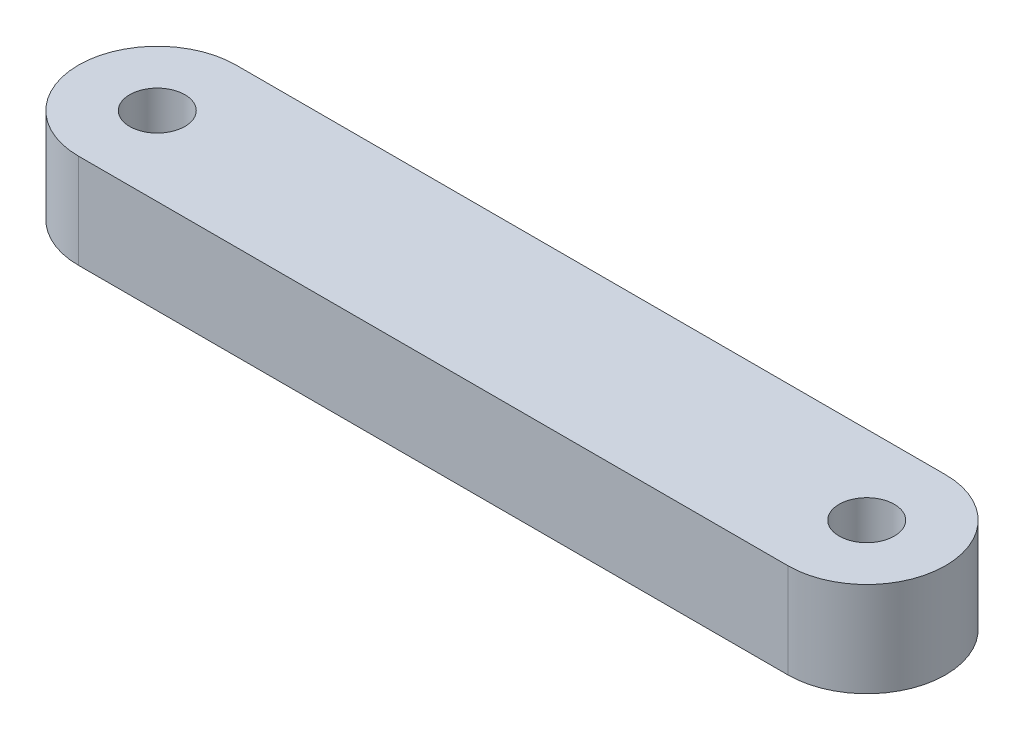
ISO-10303-21;
HEADER;
FILE_DESCRIPTION(('STEP AP214'),'2;1');
FILE_NAME('part.step','',(''),(''),'','','');
FILE_SCHEMA(('AUTOMOTIVE_DESIGN { 1 0 10303 214 1 1 1 1 }'));
ENDSEC;
DATA;
#1=APPLICATION_CONTEXT('core data for automotive mechanical design processes');
#2=APPLICATION_PROTOCOL_DEFINITION('international standard','automotive_design',2000,#1);
#3=PRODUCT_CONTEXT('',#1,'mechanical');
#4=PRODUCT('Part','Part','',(#3));
#5=PRODUCT_RELATED_PRODUCT_CATEGORY('part','',(#4));
#6=PRODUCT_DEFINITION_FORMATION('','',#4);
#7=PRODUCT_DEFINITION_CONTEXT('part definition',#1,'design');
#8=PRODUCT_DEFINITION('design','',#6,#7);
#9=PRODUCT_DEFINITION_SHAPE('','',#8);
#10=(LENGTH_UNIT() NAMED_UNIT(*) SI_UNIT(.MILLI.,.METRE.));
#11=(NAMED_UNIT(*) PLANE_ANGLE_UNIT() SI_UNIT($,.RADIAN.));
#12=(NAMED_UNIT(*) SI_UNIT($,.STERADIAN.) SOLID_ANGLE_UNIT());
#13=UNCERTAINTY_MEASURE_WITH_UNIT(LENGTH_MEASURE(1.E-05),#10,'distance_accuracy_value','');
#14=(GEOMETRIC_REPRESENTATION_CONTEXT(3) GLOBAL_UNCERTAINTY_ASSIGNED_CONTEXT((#13)) GLOBAL_UNIT_ASSIGNED_CONTEXT((#10,
#11,#12)) REPRESENTATION_CONTEXT('',''));
#15=CARTESIAN_POINT('',(0.,0.,0.));
#16=DIRECTION('',(0.,0.,1.));
#17=DIRECTION('',(1.,0.,0.));
#18=AXIS2_PLACEMENT_3D('',#15,#16,#17);
#19=CARTESIAN_POINT('',(-22.5,6.,0.));
#20=DIRECTION('',(0.,1.,0.));
#21=DIRECTION('',(0.,0.,1.));
#22=AXIS2_PLACEMENT_3D('',#19,#20,#21);
#23=PLANE('',#22);
#24=CARTESIAN_POINT('',(-22.5,6.,0.));
#25=DIRECTION('',(0.,1.,0.));
#26=DIRECTION('',(0.,0.,1.));
#27=AXIS2_PLACEMENT_3D('',#24,#25,#26);
#28=CIRCLE('',#27,1.75);
#29=CARTESIAN_POINT('',(-22.5,6.,1.75));
#30=VERTEX_POINT('',#29);
#31=EDGE_CURVE('E103',#30,#30,#28,.T.);
#32=ORIENTED_EDGE('',*,*,#31,.F.);
#33=EDGE_LOOP('',(#32));
#34=FACE_BOUND('',#33,.T.);
#35=CARTESIAN_POINT('',(-22.5,6.,0.));
#36=DIRECTION('',(0.,1.,0.));
#37=DIRECTION('',(0.,0.,1.));
#38=AXIS2_PLACEMENT_3D('',#35,#36,#37);
#39=CIRCLE('',#38,5.);
#40=CARTESIAN_POINT('',(-22.5,6.,-5.));
#41=VERTEX_POINT('',#40);
#42=CARTESIAN_POINT('',(-22.5,6.,5.));
#43=VERTEX_POINT('',#42);
#44=EDGE_CURVE('E88',#41,#43,#39,.T.);
#45=ORIENTED_EDGE('',*,*,#44,.T.);
#46=DIRECTION('',(1.,0.,0.));
#47=VECTOR('',#46,1.);
#48=CARTESIAN_POINT('',(-22.5,6.,5.));
#49=LINE('',#48,#47);
#50=CARTESIAN_POINT('',(22.5,6.,5.));
#51=VERTEX_POINT('',#50);
#52=EDGE_CURVE('E83',#43,#51,#49,.T.);
#53=ORIENTED_EDGE('',*,*,#52,.T.);
#54=CARTESIAN_POINT('',(22.5,6.,0.));
#55=DIRECTION('',(0.,1.,0.));
#56=DIRECTION('',(0.,0.,1.));
#57=AXIS2_PLACEMENT_3D('',#54,#55,#56);
#58=CIRCLE('',#57,5.);
#59=CARTESIAN_POINT('',(22.5,6.,-5.00000000000001));
#60=VERTEX_POINT('',#59);
#61=EDGE_CURVE('E86',#51,#60,#58,.T.);
#62=ORIENTED_EDGE('',*,*,#61,.T.);
#63=DIRECTION('',(-1.,0.,0.));
#64=VECTOR('',#63,1.);
#65=CARTESIAN_POINT('',(-22.5,6.,-5.));
#66=LINE('',#65,#64);
#67=EDGE_CURVE('E53',#60,#41,#66,.T.);
#68=ORIENTED_EDGE('',*,*,#67,.T.);
#69=EDGE_LOOP('',(#45,#53,#62,#68));
#70=FACE_BOUND('',#69,.T.);
#71=CARTESIAN_POINT('',(22.5,6.,0.));
#72=DIRECTION('',(0.,1.,0.));
#73=DIRECTION('',(0.,0.,1.));
#74=AXIS2_PLACEMENT_3D('',#71,#72,#73);
#75=CIRCLE('',#74,1.75);
#76=CARTESIAN_POINT('',(22.5,6.,1.75));
#77=VERTEX_POINT('',#76);
#78=EDGE_CURVE('E118',#77,#77,#75,.T.);
#79=ORIENTED_EDGE('',*,*,#78,.F.);
#80=EDGE_LOOP('',(#79));
#81=FACE_BOUND('',#80,.T.);
#82=ADVANCED_FACE('F36',(#34,#70,#81),#23,.T.);
#83=CARTESIAN_POINT('',(-22.5,0.,0.));
#84=DIRECTION('',(0.,1.,0.));
#85=DIRECTION('',(0.,0.,1.));
#86=AXIS2_PLACEMENT_3D('',#83,#84,#85);
#87=PLANE('',#86);
#88=CARTESIAN_POINT('',(-22.5,0.,0.));
#89=DIRECTION('',(0.,1.,0.));
#90=DIRECTION('',(0.,0.,1.));
#91=AXIS2_PLACEMENT_3D('',#88,#89,#90);
#92=CIRCLE('',#91,5.);
#93=CARTESIAN_POINT('',(-22.5,0.,-5.));
#94=VERTEX_POINT('',#93);
#95=CARTESIAN_POINT('',(-22.5,0.,5.));
#96=VERTEX_POINT('',#95);
#97=EDGE_CURVE('E100',#94,#96,#92,.T.);
#98=ORIENTED_EDGE('',*,*,#97,.F.);
#99=DIRECTION('',(-1.,0.,0.));
#100=VECTOR('',#99,1.);
#101=CARTESIAN_POINT('',(-22.5,0.,-5.));
#102=LINE('',#101,#100);
#103=CARTESIAN_POINT('',(22.5,0.,-5.00000000000001));
#104=VERTEX_POINT('',#103);
#105=EDGE_CURVE('E76',#104,#94,#102,.T.);
#106=ORIENTED_EDGE('',*,*,#105,.F.);
#107=CARTESIAN_POINT('',(22.5,0.,0.));
#108=DIRECTION('',(0.,1.,0.));
#109=DIRECTION('',(0.,0.,1.));
#110=AXIS2_PLACEMENT_3D('',#107,#108,#109);
#111=CIRCLE('',#110,5.);
#112=CARTESIAN_POINT('',(22.5,0.,5.));
#113=VERTEX_POINT('',#112);
#114=EDGE_CURVE('E70',#113,#104,#111,.T.);
#115=ORIENTED_EDGE('',*,*,#114,.F.);
#116=DIRECTION('',(1.,0.,0.));
#117=VECTOR('',#116,1.);
#118=CARTESIAN_POINT('',(-22.5,0.,5.));
#119=LINE('',#118,#117);
#120=EDGE_CURVE('E92',#96,#113,#119,.T.);
#121=ORIENTED_EDGE('',*,*,#120,.F.);
#122=EDGE_LOOP('',(#98,#106,#115,#121));
#123=FACE_BOUND('',#122,.T.);
#124=CARTESIAN_POINT('',(-22.5,0.,0.));
#125=DIRECTION('',(0.,1.,0.));
#126=DIRECTION('',(0.,0.,1.));
#127=AXIS2_PLACEMENT_3D('',#124,#125,#126);
#128=CIRCLE('',#127,1.75);
#129=CARTESIAN_POINT('',(-22.5,0.,1.75));
#130=VERTEX_POINT('',#129);
#131=EDGE_CURVE('E115',#130,#130,#128,.T.);
#132=ORIENTED_EDGE('',*,*,#131,.T.);
#133=EDGE_LOOP('',(#132));
#134=FACE_BOUND('',#133,.T.);
#135=CARTESIAN_POINT('',(22.5,0.,0.));
#136=DIRECTION('',(0.,1.,0.));
#137=DIRECTION('',(0.,0.,1.));
#138=AXIS2_PLACEMENT_3D('',#135,#136,#137);
#139=CIRCLE('',#138,1.75);
#140=CARTESIAN_POINT('',(22.5,0.,1.75));
#141=VERTEX_POINT('',#140);
#142=EDGE_CURVE('E121',#141,#141,#139,.T.);
#143=ORIENTED_EDGE('',*,*,#142,.T.);
#144=EDGE_LOOP('',(#143));
#145=FACE_BOUND('',#144,.T.);
#146=ADVANCED_FACE('F111',(#123,#134,#145),#87,.F.);
#147=CARTESIAN_POINT('',(-22.5,6.,0.));
#148=DIRECTION('',(0.,-1.,0.));
#149=DIRECTION('',(0.,0.,-1.));
#150=AXIS2_PLACEMENT_3D('',#147,#148,#149);
#151=CYLINDRICAL_SURFACE('',#150,5.);
#152=ORIENTED_EDGE('',*,*,#97,.T.);
#153=DIRECTION('',(0.,-1.,0.));
#154=VECTOR('',#153,1.);
#155=CARTESIAN_POINT('',(-22.5,6.,5.));
#156=LINE('',#155,#154);
#157=EDGE_CURVE('E11',#43,#96,#156,.T.);
#158=ORIENTED_EDGE('',*,*,#157,.F.);
#159=ORIENTED_EDGE('',*,*,#44,.F.);
#160=DIRECTION('',(0.,-1.,0.));
#161=VECTOR('',#160,1.);
#162=CARTESIAN_POINT('',(-22.5,6.,-5.));
#163=LINE('',#162,#161);
#164=EDGE_CURVE('E96',#41,#94,#163,.T.);
#165=ORIENTED_EDGE('',*,*,#164,.T.);
#166=EDGE_LOOP('',(#152,#158,#159,#165));
#167=FACE_BOUND('',#166,.T.);
#168=ADVANCED_FACE('F38',(#167),#151,.T.);
#169=CARTESIAN_POINT('',(-22.5,6.,5.));
#170=DIRECTION('',(0.,0.,-1.));
#171=DIRECTION('',(-1.,0.,0.));
#172=AXIS2_PLACEMENT_3D('',#169,#170,#171);
#173=PLANE('',#172);
#174=ORIENTED_EDGE('',*,*,#120,.T.);
#175=DIRECTION('',(0.,-1.,0.));
#176=VECTOR('',#175,1.);
#177=CARTESIAN_POINT('',(22.5,6.,5.));
#178=LINE('',#177,#176);
#179=EDGE_CURVE('E45',#51,#113,#178,.T.);
#180=ORIENTED_EDGE('',*,*,#179,.F.);
#181=ORIENTED_EDGE('',*,*,#52,.F.);
#182=ORIENTED_EDGE('',*,*,#157,.T.);
#183=EDGE_LOOP('',(#174,#180,#181,#182));
#184=FACE_BOUND('',#183,.T.);
#185=ADVANCED_FACE('F91',(#184),#173,.F.);
#186=CARTESIAN_POINT('',(22.5,6.,0.));
#187=DIRECTION('',(0.,-1.,0.));
#188=DIRECTION('',(0.,0.,-1.));
#189=AXIS2_PLACEMENT_3D('',#186,#187,#188);
#190=CYLINDRICAL_SURFACE('',#189,5.);
#191=ORIENTED_EDGE('',*,*,#114,.T.);
#192=DIRECTION('',(0.,-1.,0.));
#193=VECTOR('',#192,1.);
#194=CARTESIAN_POINT('',(22.5,6.,-5.00000000000001));
#195=LINE('',#194,#193);
#196=EDGE_CURVE('E93',#60,#104,#195,.T.);
#197=ORIENTED_EDGE('',*,*,#196,.F.);
#198=ORIENTED_EDGE('',*,*,#61,.F.);
#199=ORIENTED_EDGE('',*,*,#179,.T.);
#200=EDGE_LOOP('',(#191,#197,#198,#199));
#201=FACE_BOUND('',#200,.T.);
#202=ADVANCED_FACE('F94',(#201),#190,.T.);
#203=CARTESIAN_POINT('',(-22.5,6.,-5.));
#204=DIRECTION('',(0.,0.,1.));
#205=DIRECTION('',(1.,0.,0.));
#206=AXIS2_PLACEMENT_3D('',#203,#204,#205);
#207=PLANE('',#206);
#208=ORIENTED_EDGE('',*,*,#105,.T.);
#209=ORIENTED_EDGE('',*,*,#164,.F.);
#210=ORIENTED_EDGE('',*,*,#67,.F.);
#211=ORIENTED_EDGE('',*,*,#196,.T.);
#212=EDGE_LOOP('',(#208,#209,#210,#211));
#213=FACE_BOUND('',#212,.T.);
#214=ADVANCED_FACE('F108',(#213),#207,.F.);
#215=CARTESIAN_POINT('',(-22.5,6.,0.));
#216=DIRECTION('',(0.,-1.,0.));
#217=DIRECTION('',(0.,0.,-1.));
#218=AXIS2_PLACEMENT_3D('',#215,#216,#217);
#219=CYLINDRICAL_SURFACE('',#218,1.75);
#220=ORIENTED_EDGE('',*,*,#31,.T.);
#221=EDGE_LOOP('',(#220));
#222=FACE_BOUND('',#221,.T.);
#223=ORIENTED_EDGE('',*,*,#131,.F.);
#224=EDGE_LOOP('',(#223));
#225=FACE_BOUND('',#224,.T.);
#226=ADVANCED_FACE('F138',(#222,#225),#219,.F.);
#227=CARTESIAN_POINT('',(22.5,6.,0.));
#228=DIRECTION('',(0.,-1.,0.));
#229=DIRECTION('',(0.,0.,-1.));
#230=AXIS2_PLACEMENT_3D('',#227,#228,#229);
#231=CYLINDRICAL_SURFACE('',#230,1.75);
#232=ORIENTED_EDGE('',*,*,#78,.T.);
#233=EDGE_LOOP('',(#232));
#234=FACE_BOUND('',#233,.T.);
#235=ORIENTED_EDGE('',*,*,#142,.F.);
#236=EDGE_LOOP('',(#235));
#237=FACE_BOUND('',#236,.T.);
#238=ADVANCED_FACE('F127',(#234,#237),#231,.F.);
#239=CLOSED_SHELL('',(#82,#146,#168,#185,#202,#214,#226,#238));
#240=MANIFOLD_SOLID_BREP('B2',#239);
#241=ADVANCED_BREP_SHAPE_REPRESENTATION('',(#18,#240),#14);
#242=SHAPE_DEFINITION_REPRESENTATION(#9,#241);
ENDSEC;
END-ISO-10303-21;
